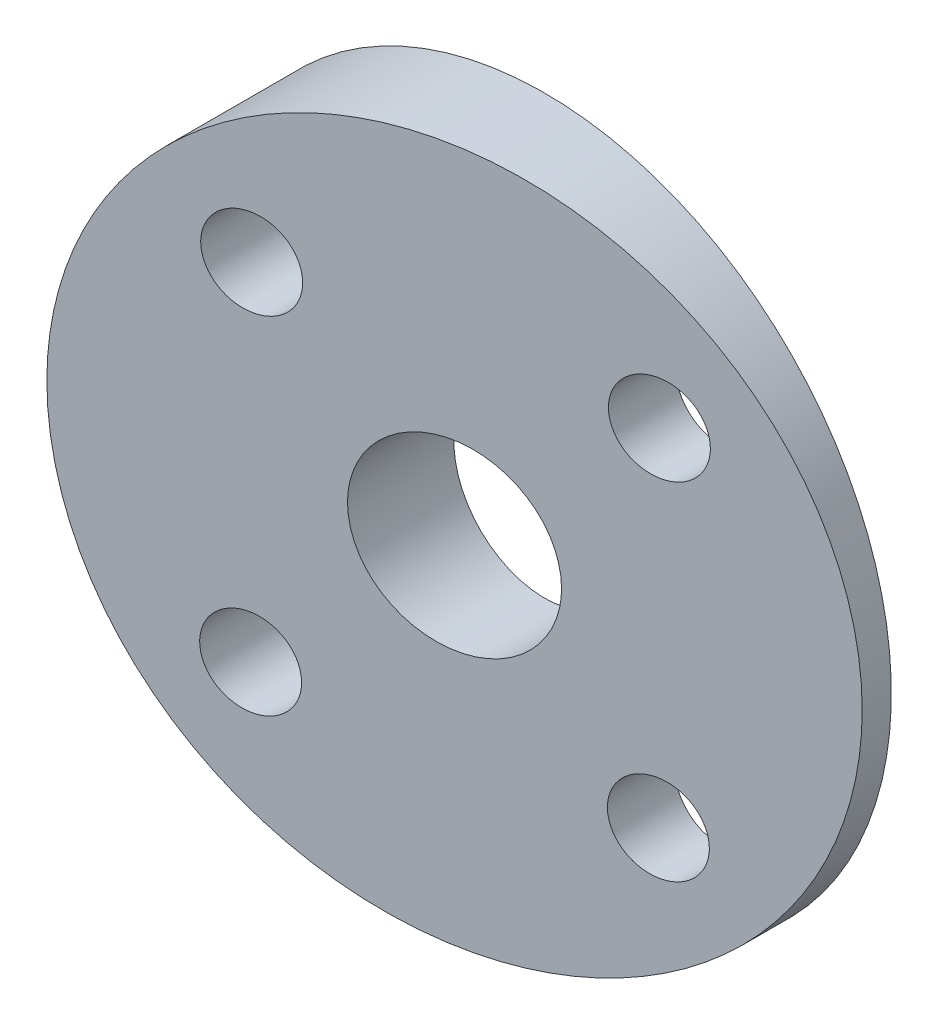
ISO-10303-21;
HEADER;
FILE_DESCRIPTION(('STEP AP214'),'2;1');
FILE_NAME('part.step','',(''),(''),'','','');
FILE_SCHEMA(('AUTOMOTIVE_DESIGN { 1 0 10303 214 1 1 1 1 }'));
ENDSEC;
DATA;
#1=APPLICATION_CONTEXT('core data for automotive mechanical design processes');
#2=APPLICATION_PROTOCOL_DEFINITION('international standard','automotive_design',2000,#1);
#3=PRODUCT_CONTEXT('',#1,'mechanical');
#4=PRODUCT('Part','Part','',(#3));
#5=PRODUCT_RELATED_PRODUCT_CATEGORY('part','',(#4));
#6=PRODUCT_DEFINITION_FORMATION('','',#4);
#7=PRODUCT_DEFINITION_CONTEXT('part definition',#1,'design');
#8=PRODUCT_DEFINITION('design','',#6,#7);
#9=PRODUCT_DEFINITION_SHAPE('','',#8);
#10=(LENGTH_UNIT() NAMED_UNIT(*) SI_UNIT(.MILLI.,.METRE.));
#11=(NAMED_UNIT(*) PLANE_ANGLE_UNIT() SI_UNIT($,.RADIAN.));
#12=(NAMED_UNIT(*) SI_UNIT($,.STERADIAN.) SOLID_ANGLE_UNIT());
#13=UNCERTAINTY_MEASURE_WITH_UNIT(LENGTH_MEASURE(1.E-05),#10,'distance_accuracy_value','');
#14=(GEOMETRIC_REPRESENTATION_CONTEXT(3) GLOBAL_UNCERTAINTY_ASSIGNED_CONTEXT((#13)) GLOBAL_UNIT_ASSIGNED_CONTEXT((#10,
#11,#12)) REPRESENTATION_CONTEXT('',''));
#15=CARTESIAN_POINT('',(0.,0.,0.));
#16=DIRECTION('',(0.,0.,1.));
#17=DIRECTION('',(1.,0.,0.));
#18=AXIS2_PLACEMENT_3D('',#15,#16,#17);
#19=CARTESIAN_POINT('',(0.,48.,-10.));
#20=DIRECTION('',(0.,0.,1.));
#21=DIRECTION('',(1.,0.,0.));
#22=AXIS2_PLACEMENT_3D('',#19,#20,#21);
#23=PLANE('',#22);
#24=CARTESIAN_POINT('',(-5.62968108342815,24.9790510727815,-10.));
#25=DIRECTION('',(0.,0.,1.));
#26=DIRECTION('',(1.,0.,0.));
#27=AXIS2_PLACEMENT_3D('',#24,#25,#26);
#28=CIRCLE('',#27,2.);
#29=CARTESIAN_POINT('',(-3.62968108342815,24.9790510727815,-10.));
#30=VERTEX_POINT('',#29);
#31=EDGE_CURVE('E10',#30,#30,#28,.T.);
#32=ORIENTED_EDGE('',*,*,#31,.T.);
#33=EDGE_LOOP('',(#32));
#34=FACE_BOUND('',#33,.T.);
#35=CARTESIAN_POINT('',(-21.5913355474178,41.0209489272188,-10.));
#36=DIRECTION('',(0.,0.,1.));
#37=DIRECTION('',(1.,0.,0.));
#38=AXIS2_PLACEMENT_3D('',#35,#36,#37);
#39=CIRCLE('',#38,2.);
#40=CARTESIAN_POINT('',(-19.5913355474178,41.0209489272188,-10.));
#41=VERTEX_POINT('',#40);
#42=EDGE_CURVE('E42',#41,#41,#39,.T.);
#43=ORIENTED_EDGE('',*,*,#42,.T.);
#44=EDGE_LOOP('',(#43));
#45=FACE_BOUND('',#44,.T.);
#46=CARTESIAN_POINT('',(-21.6314572426416,25.0191727680053,-10.));
#47=DIRECTION('',(0.,0.,1.));
#48=DIRECTION('',(1.,0.,0.));
#49=AXIS2_PLACEMENT_3D('',#46,#47,#48);
#50=CIRCLE('',#49,2.);
#51=CARTESIAN_POINT('',(-19.6314572426416,25.0191727680053,-10.));
#52=VERTEX_POINT('',#51);
#53=EDGE_CURVE('E46',#52,#52,#50,.T.);
#54=ORIENTED_EDGE('',*,*,#53,.T.);
#55=EDGE_LOOP('',(#54));
#56=FACE_BOUND('',#55,.T.);
#57=CARTESIAN_POINT('',(-13.6296810834282,32.9790510727815,-10.));
#58=DIRECTION('',(0.,0.,1.));
#59=DIRECTION('',(1.,0.,0.));
#60=AXIS2_PLACEMENT_3D('',#57,#58,#59);
#61=CIRCLE('',#60,4.2);
#62=CARTESIAN_POINT('',(-9.42968108342816,32.9790510727815,-10.));
#63=VERTEX_POINT('',#62);
#64=EDGE_CURVE('E51',#63,#63,#61,.T.);
#65=ORIENTED_EDGE('',*,*,#64,.T.);
#66=EDGE_LOOP('',(#65));
#67=FACE_BOUND('',#66,.T.);
#68=CARTESIAN_POINT('',(-5.58955938820431,40.9808272319949,-10.));
#69=DIRECTION('',(0.,0.,1.));
#70=DIRECTION('',(1.,0.,0.));
#71=AXIS2_PLACEMENT_3D('',#68,#69,#70);
#72=CIRCLE('',#71,2.00000000000001);
#73=CARTESIAN_POINT('',(-3.5895593882043,40.9808272319949,-10.));
#74=VERTEX_POINT('',#73);
#75=EDGE_CURVE('E54',#74,#74,#72,.T.);
#76=ORIENTED_EDGE('',*,*,#75,.T.);
#77=EDGE_LOOP('',(#76));
#78=FACE_BOUND('',#77,.T.);
#79=CARTESIAN_POINT('',(-13.6296810834282,32.9790510727815,-10.));
#80=DIRECTION('',(0.,0.,-1.));
#81=DIRECTION('',(-1.,0.,0.));
#82=AXIS2_PLACEMENT_3D('',#79,#80,#81);
#83=CIRCLE('',#82,16.);
#84=CARTESIAN_POINT('',(-29.6296810834282,32.9790510727815,-10.));
#85=VERTEX_POINT('',#84);
#86=EDGE_CURVE('E72',#85,#85,#83,.T.);
#87=ORIENTED_EDGE('',*,*,#86,.T.);
#88=EDGE_LOOP('',(#87));
#89=FACE_BOUND('',#88,.T.);
#90=ADVANCED_FACE('F35',(#34,#45,#56,#67,#78,#89),#23,.F.);
#91=CARTESIAN_POINT('',(-1.40856382055784,69.4,-7.98836238730129));
#92=DIRECTION('',(0.173648177666923,0.,0.984807753012209));
#93=DIRECTION('',(0.984807753012209,0.,-0.173648177666923));
#94=AXIS2_PLACEMENT_3D('',#91,#92,#93);
#95=PLANE('',#94);
#96=CARTESIAN_POINT('',(-5.58955938820431,40.9808272319949,-7.25114006250274));
#97=DIRECTION('',(0.173648177666923,0.,0.984807753012209));
#98=DIRECTION('',(-0.984807753012209,0.,0.173648177666923));
#99=AXIS2_PLACEMENT_3D('',#96,#97,#98);
#100=ELLIPSE('',#99,2.03085322377149,2.00000000000001);
#101=CARTESIAN_POINT('',(-7.58955938820432,40.9808272319949,-6.89848610108583));
#102=VERTEX_POINT('',#101);
#103=EDGE_CURVE('E57',#102,#102,#100,.F.);
#104=ORIENTED_EDGE('',*,*,#103,.T.);
#105=EDGE_LOOP('',(#104));
#106=FACE_BOUND('',#105,.T.);
#107=CARTESIAN_POINT('',(-13.6296810834282,32.9790510727815,-5.83344967945534));
#108=DIRECTION('',(0.173648177666923,0.,0.984807753012209));
#109=DIRECTION('',(-0.984807753012209,0.,0.173648177666923));
#110=AXIS2_PLACEMENT_3D('',#107,#108,#109);
#111=ELLIPSE('',#110,4.26479176992013,4.2);
#112=CARTESIAN_POINT('',(-17.8296810834282,32.9790510727815,-5.09287636047982));
#113=VERTEX_POINT('',#112);
#114=EDGE_CURVE('E60',#113,#113,#111,.F.);
#115=ORIENTED_EDGE('',*,*,#114,.T.);
#116=EDGE_LOOP('',(#115));
#117=FACE_BOUND('',#116,.T.);
#118=CARTESIAN_POINT('',(-21.6314572426416,25.0191727680053,-4.42252064899631));
#119=DIRECTION('',(0.173648177666923,0.,0.984807753012209));
#120=DIRECTION('',(-0.984807753012209,0.,0.173648177666923));
#121=AXIS2_PLACEMENT_3D('',#118,#119,#120);
#122=ELLIPSE('',#121,2.03085322377149,2.);
#123=CARTESIAN_POINT('',(-23.6314572426416,25.0191727680053,-4.0698666875794));
#124=VERTEX_POINT('',#123);
#125=EDGE_CURVE('E63',#124,#124,#122,.F.);
#126=ORIENTED_EDGE('',*,*,#125,.T.);
#127=EDGE_LOOP('',(#126));
#128=FACE_BOUND('',#127,.T.);
#129=CARTESIAN_POINT('',(-21.5913355474178,41.0209489272188,-4.42959518637605));
#130=DIRECTION('',(0.173648177666923,0.,0.984807753012209));
#131=DIRECTION('',(-0.984807753012209,0.,0.173648177666923));
#132=AXIS2_PLACEMENT_3D('',#129,#130,#131);
#133=ELLIPSE('',#132,2.03085322377149,2.);
#134=CARTESIAN_POINT('',(-23.5913355474178,41.0209489272188,-4.07694122495913));
#135=VERTEX_POINT('',#134);
#136=EDGE_CURVE('E66',#135,#135,#133,.F.);
#137=ORIENTED_EDGE('',*,*,#136,.T.);
#138=EDGE_LOOP('',(#137));
#139=FACE_BOUND('',#138,.T.);
#140=CARTESIAN_POINT('',(-5.62968108342815,24.9790510727815,-7.24406552512301));
#141=DIRECTION('',(0.173648177666923,0.,0.984807753012209));
#142=DIRECTION('',(-0.984807753012209,0.,0.173648177666923));
#143=AXIS2_PLACEMENT_3D('',#140,#141,#142);
#144=ELLIPSE('',#143,2.03085322377149,2.);
#145=CARTESIAN_POINT('',(-7.62968108342815,24.9790510727815,-6.89141156370609));
#146=VERTEX_POINT('',#145);
#147=EDGE_CURVE('E69',#146,#146,#144,.F.);
#148=ORIENTED_EDGE('',*,*,#147,.T.);
#149=EDGE_LOOP('',(#148));
#150=FACE_BOUND('',#149,.T.);
#151=CARTESIAN_POINT('',(-13.6296810834282,32.9790510727815,-5.83344967945535));
#152=DIRECTION('',(0.173648177666923,0.,0.984807753012209));
#153=DIRECTION('',(0.984807753012209,0.,-0.173648177666923));
#154=AXIS2_PLACEMENT_3D('',#151,#152,#153);
#155=ELLIPSE('',#154,16.2468257901719,16.);
#156=CARTESIAN_POINT('',(2.37031891657184,32.9790510727815,-8.65468137079068));
#157=VERTEX_POINT('',#156);
#158=EDGE_CURVE('E38',#157,#157,#155,.T.);
#159=ORIENTED_EDGE('',*,*,#158,.T.);
#160=EDGE_LOOP('',(#159));
#161=FACE_BOUND('',#160,.T.);
#162=ADVANCED_FACE('F79',(#106,#117,#128,#139,#150,#161),#95,.T.);
#163=CARTESIAN_POINT('',(-5.58955938820431,40.9808272319949,-48.));
#164=DIRECTION('',(0.,0.,1.));
#165=DIRECTION('',(1.,0.,0.));
#166=AXIS2_PLACEMENT_3D('',#163,#164,#165);
#167=CYLINDRICAL_SURFACE('',#166,2.00000000000001);
#168=ORIENTED_EDGE('',*,*,#75,.F.);
#169=EDGE_LOOP('',(#168));
#170=FACE_BOUND('',#169,.T.);
#171=ORIENTED_EDGE('',*,*,#103,.F.);
#172=EDGE_LOOP('',(#171));
#173=FACE_BOUND('',#172,.T.);
#174=ADVANCED_FACE('F97',(#170,#173),#167,.F.);
#175=CARTESIAN_POINT('',(-13.6296810834282,32.9790510727815,-48.));
#176=DIRECTION('',(0.,0.,1.));
#177=DIRECTION('',(1.,0.,0.));
#178=AXIS2_PLACEMENT_3D('',#175,#176,#177);
#179=CYLINDRICAL_SURFACE('',#178,4.2);
#180=ORIENTED_EDGE('',*,*,#64,.F.);
#181=EDGE_LOOP('',(#180));
#182=FACE_BOUND('',#181,.T.);
#183=ORIENTED_EDGE('',*,*,#114,.F.);
#184=EDGE_LOOP('',(#183));
#185=FACE_BOUND('',#184,.T.);
#186=ADVANCED_FACE('F110',(#182,#185),#179,.F.);
#187=CARTESIAN_POINT('',(-21.6314572426416,25.0191727680053,-48.));
#188=DIRECTION('',(0.,0.,1.));
#189=DIRECTION('',(1.,0.,0.));
#190=AXIS2_PLACEMENT_3D('',#187,#188,#189);
#191=CYLINDRICAL_SURFACE('',#190,2.);
#192=ORIENTED_EDGE('',*,*,#53,.F.);
#193=EDGE_LOOP('',(#192));
#194=FACE_BOUND('',#193,.T.);
#195=ORIENTED_EDGE('',*,*,#125,.F.);
#196=EDGE_LOOP('',(#195));
#197=FACE_BOUND('',#196,.T.);
#198=ADVANCED_FACE('F123',(#194,#197),#191,.F.);
#199=CARTESIAN_POINT('',(-21.5913355474178,41.0209489272188,-48.));
#200=DIRECTION('',(0.,0.,1.));
#201=DIRECTION('',(1.,0.,0.));
#202=AXIS2_PLACEMENT_3D('',#199,#200,#201);
#203=CYLINDRICAL_SURFACE('',#202,2.);
#204=ORIENTED_EDGE('',*,*,#42,.F.);
#205=EDGE_LOOP('',(#204));
#206=FACE_BOUND('',#205,.T.);
#207=ORIENTED_EDGE('',*,*,#136,.F.);
#208=EDGE_LOOP('',(#207));
#209=FACE_BOUND('',#208,.T.);
#210=ADVANCED_FACE('F89',(#206,#209),#203,.F.);
#211=CARTESIAN_POINT('',(-5.62968108342815,24.9790510727815,-48.));
#212=DIRECTION('',(0.,0.,1.));
#213=DIRECTION('',(1.,0.,0.));
#214=AXIS2_PLACEMENT_3D('',#211,#212,#213);
#215=CYLINDRICAL_SURFACE('',#214,2.);
#216=ORIENTED_EDGE('',*,*,#31,.F.);
#217=EDGE_LOOP('',(#216));
#218=FACE_BOUND('',#217,.T.);
#219=ORIENTED_EDGE('',*,*,#147,.F.);
#220=EDGE_LOOP('',(#219));
#221=FACE_BOUND('',#220,.T.);
#222=ADVANCED_FACE('F84',(#218,#221),#215,.F.);
#223=CARTESIAN_POINT('',(-13.6296810834282,32.9790510727815,3.7));
#224=DIRECTION('',(0.,0.,-1.));
#225=DIRECTION('',(-1.,0.,0.));
#226=AXIS2_PLACEMENT_3D('',#223,#224,#225);
#227=CYLINDRICAL_SURFACE('',#226,16.);
#228=ORIENTED_EDGE('',*,*,#158,.F.);
#229=EDGE_LOOP('',(#228));
#230=FACE_BOUND('',#229,.T.);
#231=ORIENTED_EDGE('',*,*,#86,.F.);
#232=EDGE_LOOP('',(#231));
#233=FACE_BOUND('',#232,.T.);
#234=ADVANCED_FACE('F81',(#230,#233),#227,.T.);
#235=CLOSED_SHELL('',(#90,#162,#174,#186,#198,#210,#222,#234));
#236=MANIFOLD_SOLID_BREP('B2',#235);
#237=ADVANCED_BREP_SHAPE_REPRESENTATION('',(#18,#236),#14);
#238=SHAPE_DEFINITION_REPRESENTATION(#9,#237);
ENDSEC;
END-ISO-10303-21;
